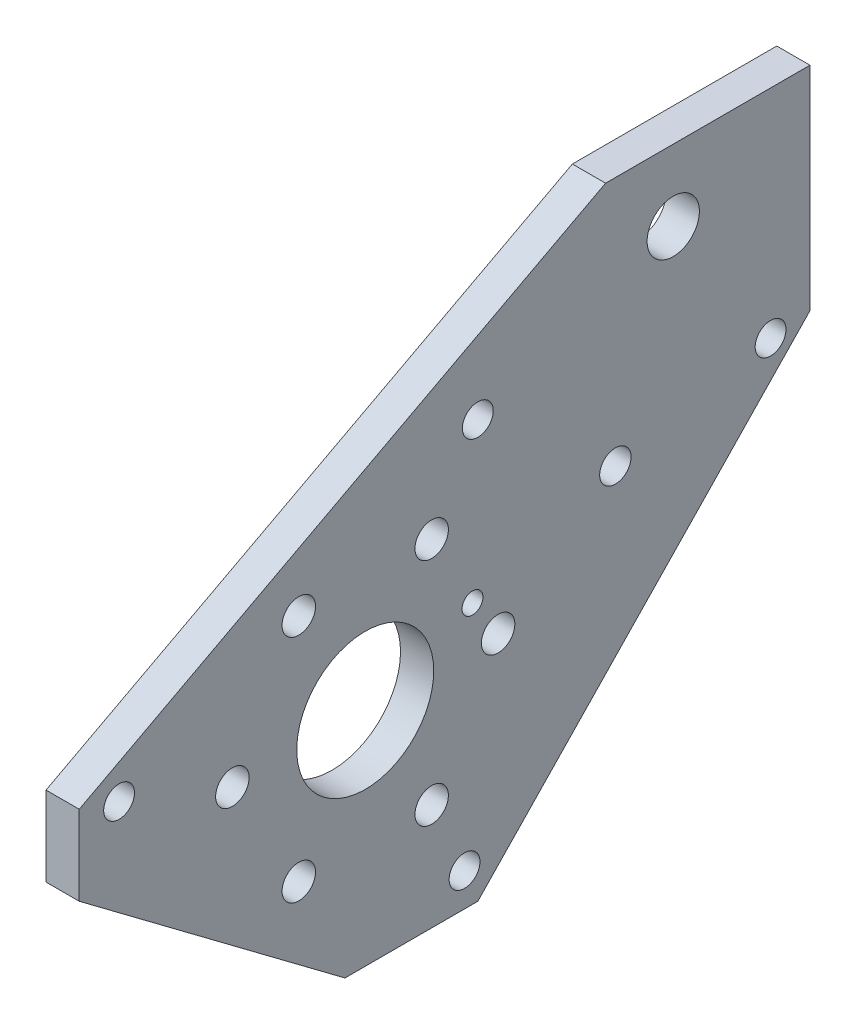
ISO-10303-21;
HEADER;
FILE_DESCRIPTION(('STEP AP214'),'2;1');
FILE_NAME('part.step','',(''),(''),'','','');
FILE_SCHEMA(('AUTOMOTIVE_DESIGN { 1 0 10303 214 1 1 1 1 }'));
ENDSEC;
DATA;
#1=APPLICATION_CONTEXT('core data for automotive mechanical design processes');
#2=APPLICATION_PROTOCOL_DEFINITION('international standard','automotive_design',2000,#1);
#3=PRODUCT_CONTEXT('',#1,'mechanical');
#4=PRODUCT('Part','Part','',(#3));
#5=PRODUCT_RELATED_PRODUCT_CATEGORY('part','',(#4));
#6=PRODUCT_DEFINITION_FORMATION('','',#4);
#7=PRODUCT_DEFINITION_CONTEXT('part definition',#1,'design');
#8=PRODUCT_DEFINITION('design','',#6,#7);
#9=PRODUCT_DEFINITION_SHAPE('','',#8);
#10=(LENGTH_UNIT() NAMED_UNIT(*) SI_UNIT(.MILLI.,.METRE.));
#11=(NAMED_UNIT(*) PLANE_ANGLE_UNIT() SI_UNIT($,.RADIAN.));
#12=(NAMED_UNIT(*) SI_UNIT($,.STERADIAN.) SOLID_ANGLE_UNIT());
#13=UNCERTAINTY_MEASURE_WITH_UNIT(LENGTH_MEASURE(1.E-05),#10,'distance_accuracy_value','');
#14=(GEOMETRIC_REPRESENTATION_CONTEXT(3) GLOBAL_UNCERTAINTY_ASSIGNED_CONTEXT((#13)) GLOBAL_UNIT_ASSIGNED_CONTEXT((#10,
#11,#12)) REPRESENTATION_CONTEXT('',''));
#15=CARTESIAN_POINT('',(0.,0.,0.));
#16=DIRECTION('',(0.,0.,1.));
#17=DIRECTION('',(1.,0.,0.));
#18=AXIS2_PLACEMENT_3D('',#15,#16,#17);
#19=CARTESIAN_POINT('',(3.175,0.,0.));
#20=DIRECTION('',(0.,0.,-1.));
#21=DIRECTION('',(-1.,0.,0.));
#22=AXIS2_PLACEMENT_3D('',#19,#20,#21);
#23=PLANE('',#22);
#24=DIRECTION('',(0.,-1.,0.));
#25=VECTOR('',#24,1.);
#26=CARTESIAN_POINT('',(0.,0.,0.));
#27=LINE('',#26,#25);
#28=CARTESIAN_POINT('',(0.,26.67,0.));
#29=VERTEX_POINT('',#28);
#30=CARTESIAN_POINT('',(0.,19.05,0.));
#31=VERTEX_POINT('',#30);
#32=EDGE_CURVE('E109',#29,#31,#27,.T.);
#33=ORIENTED_EDGE('',*,*,#32,.T.);
#34=DIRECTION('',(1.,0.,0.));
#35=VECTOR('',#34,1.);
#36=CARTESIAN_POINT('',(0.,19.05,0.));
#37=LINE('',#36,#35);
#38=CARTESIAN_POINT('',(3.175,19.05,0.));
#39=VERTEX_POINT('',#38);
#40=EDGE_CURVE('E47',#31,#39,#37,.T.);
#41=ORIENTED_EDGE('',*,*,#40,.T.);
#42=DIRECTION('',(0.,-1.,0.));
#43=VECTOR('',#42,1.);
#44=CARTESIAN_POINT('',(3.175,0.,0.));
#45=LINE('',#44,#43);
#46=CARTESIAN_POINT('',(3.175,26.67,0.));
#47=VERTEX_POINT('',#46);
#48=EDGE_CURVE('E118',#47,#39,#45,.T.);
#49=ORIENTED_EDGE('',*,*,#48,.F.);
#50=DIRECTION('',(1.,0.,0.));
#51=VECTOR('',#50,1.);
#52=CARTESIAN_POINT('',(0.,26.67,0.));
#53=LINE('',#52,#51);
#54=EDGE_CURVE('E144',#29,#47,#53,.T.);
#55=ORIENTED_EDGE('',*,*,#54,.F.);
#56=EDGE_LOOP('',(#33,#41,#49,#55));
#57=FACE_BOUND('',#56,.T.);
#58=ADVANCED_FACE('F32',(#57),#23,.F.);
#59=CARTESIAN_POINT('',(3.175,0.,0.));
#60=DIRECTION('',(0.,1.,0.));
#61=DIRECTION('',(0.,0.,1.));
#62=AXIS2_PLACEMENT_3D('',#59,#60,#61);
#63=PLANE('',#62);
#64=DIRECTION('',(0.,0.,-1.));
#65=VECTOR('',#64,1.);
#66=CARTESIAN_POINT('',(3.175,0.,0.));
#67=LINE('',#66,#65);
#68=CARTESIAN_POINT('',(3.175,0.,-25.4));
#69=VERTEX_POINT('',#68);
#70=CARTESIAN_POINT('',(3.175,0.,-38.1));
#71=VERTEX_POINT('',#70);
#72=EDGE_CURVE('E101',#69,#71,#67,.T.);
#73=ORIENTED_EDGE('',*,*,#72,.F.);
#74=DIRECTION('',(1.,0.,0.));
#75=VECTOR('',#74,1.);
#76=CARTESIAN_POINT('',(0.,0.,-25.4));
#77=LINE('',#76,#75);
#78=CARTESIAN_POINT('',(0.,0.,-25.4));
#79=VERTEX_POINT('',#78);
#80=EDGE_CURVE('E92',#79,#69,#77,.T.);
#81=ORIENTED_EDGE('',*,*,#80,.F.);
#82=DIRECTION('',(0.,0.,-1.));
#83=VECTOR('',#82,1.);
#84=CARTESIAN_POINT('',(0.,0.,0.));
#85=LINE('',#84,#83);
#86=CARTESIAN_POINT('',(0.,0.,-38.1));
#87=VERTEX_POINT('',#86);
#88=EDGE_CURVE('E55',#79,#87,#85,.T.);
#89=ORIENTED_EDGE('',*,*,#88,.T.);
#90=DIRECTION('',(1.,0.,0.));
#91=VECTOR('',#90,1.);
#92=CARTESIAN_POINT('',(0.,0.,-38.1));
#93=LINE('',#92,#91);
#94=EDGE_CURVE('E232',#87,#71,#93,.T.);
#95=ORIENTED_EDGE('',*,*,#94,.T.);
#96=EDGE_LOOP('',(#73,#81,#89,#95));
#97=FACE_BOUND('',#96,.T.);
#98=ADVANCED_FACE('F100',(#97),#63,.F.);
#99=CARTESIAN_POINT('',(3.175,0.,-69.85));
#100=DIRECTION('',(0.,0.,1.));
#101=DIRECTION('',(1.,0.,0.));
#102=AXIS2_PLACEMENT_3D('',#99,#100,#101);
#103=PLANE('',#102);
#104=DIRECTION('',(0.,1.,0.));
#105=VECTOR('',#104,1.);
#106=CARTESIAN_POINT('',(3.175,0.,-69.85));
#107=LINE('',#106,#105);
#108=CARTESIAN_POINT('',(3.175,33.02,-69.85));
#109=VERTEX_POINT('',#108);
#110=CARTESIAN_POINT('',(3.175,53.34,-69.85));
#111=VERTEX_POINT('',#110);
#112=EDGE_CURVE('E127',#109,#111,#107,.T.);
#113=ORIENTED_EDGE('',*,*,#112,.F.);
#114=DIRECTION('',(1.,0.,0.));
#115=VECTOR('',#114,1.);
#116=CARTESIAN_POINT('',(0.,33.02,-69.85));
#117=LINE('',#116,#115);
#118=CARTESIAN_POINT('',(0.,33.02,-69.85));
#119=VERTEX_POINT('',#118);
#120=EDGE_CURVE('E234',#119,#109,#117,.T.);
#121=ORIENTED_EDGE('',*,*,#120,.F.);
#122=DIRECTION('',(0.,1.,0.));
#123=VECTOR('',#122,1.);
#124=CARTESIAN_POINT('',(0.,0.,-69.85));
#125=LINE('',#124,#123);
#126=CARTESIAN_POINT('',(0.,53.34,-69.85));
#127=VERTEX_POINT('',#126);
#128=EDGE_CURVE('E108',#119,#127,#125,.T.);
#129=ORIENTED_EDGE('',*,*,#128,.T.);
#130=DIRECTION('',(-1.,0.,0.));
#131=VECTOR('',#130,1.);
#132=CARTESIAN_POINT('',(3.175,53.34,-69.85));
#133=LINE('',#132,#131);
#134=EDGE_CURVE('E11',#111,#127,#133,.T.);
#135=ORIENTED_EDGE('',*,*,#134,.F.);
#136=EDGE_LOOP('',(#113,#121,#129,#135));
#137=FACE_BOUND('',#136,.T.);
#138=ADVANCED_FACE('F230',(#137),#103,.F.);
#139=CARTESIAN_POINT('',(3.175,53.34,0.));
#140=DIRECTION('',(0.,-1.,0.));
#141=DIRECTION('',(0.,0.,-1.));
#142=AXIS2_PLACEMENT_3D('',#139,#140,#141);
#143=PLANE('',#142);
#144=DIRECTION('',(0.,0.,1.));
#145=VECTOR('',#144,1.);
#146=CARTESIAN_POINT('',(0.,53.34,0.));
#147=LINE('',#146,#145);
#148=CARTESIAN_POINT('',(0.,53.34,-50.3135330931421));
#149=VERTEX_POINT('',#148);
#150=EDGE_CURVE('E111',#127,#149,#147,.T.);
#151=ORIENTED_EDGE('',*,*,#150,.T.);
#152=DIRECTION('',(1.,0.,0.));
#153=VECTOR('',#152,1.);
#154=CARTESIAN_POINT('',(0.,53.34,-50.3135330931421));
#155=LINE('',#154,#153);
#156=CARTESIAN_POINT('',(3.175,53.34,-50.3135330931421));
#157=VERTEX_POINT('',#156);
#158=EDGE_CURVE('E140',#149,#157,#155,.T.);
#159=ORIENTED_EDGE('',*,*,#158,.T.);
#160=DIRECTION('',(0.,0.,1.));
#161=VECTOR('',#160,1.);
#162=CARTESIAN_POINT('',(3.175,53.34,0.));
#163=LINE('',#162,#161);
#164=EDGE_CURVE('E40',#111,#157,#163,.T.);
#165=ORIENTED_EDGE('',*,*,#164,.F.);
#166=ORIENTED_EDGE('',*,*,#134,.T.);
#167=EDGE_LOOP('',(#151,#159,#165,#166));
#168=FACE_BOUND('',#167,.T.);
#169=ADVANCED_FACE('F139',(#168),#143,.F.);
#170=CARTESIAN_POINT('',(3.175,0.,0.));
#171=DIRECTION('',(-1.,0.,0.));
#172=DIRECTION('',(0.,0.,1.));
#173=AXIS2_PLACEMENT_3D('',#170,#171,#172);
#174=PLANE('',#173);
#175=CARTESIAN_POINT('',(3.175,25.4,-3.81));
#176=DIRECTION('',(1.,0.,0.));
#177=DIRECTION('',(0.,0.,-1.));
#178=AXIS2_PLACEMENT_3D('',#175,#176,#177);
#179=CIRCLE('',#178,1.4732);
#180=CARTESIAN_POINT('',(3.175,25.4,-5.2832));
#181=VERTEX_POINT('',#180);
#182=EDGE_CURVE('E263',#181,#181,#179,.T.);
#183=ORIENTED_EDGE('',*,*,#182,.F.);
#184=EDGE_LOOP('',(#183));
#185=FACE_BOUND('',#184,.T.);
#186=CARTESIAN_POINT('',(3.175,3.175,-36.83));
#187=DIRECTION('',(1.,0.,0.));
#188=DIRECTION('',(0.,0.,-1.));
#189=AXIS2_PLACEMENT_3D('',#186,#187,#188);
#190=CIRCLE('',#189,1.4732);
#191=CARTESIAN_POINT('',(3.175,3.175,-38.3032));
#192=VERTEX_POINT('',#191);
#193=EDGE_CURVE('E258',#192,#192,#190,.T.);
#194=ORIENTED_EDGE('',*,*,#193,.F.);
#195=EDGE_LOOP('',(#194));
#196=FACE_BOUND('',#195,.T.);
#197=CARTESIAN_POINT('',(3.175,32.62292688,-66.08666234));
#198=DIRECTION('',(1.,0.,0.));
#199=DIRECTION('',(0.,0.,-1.));
#200=AXIS2_PLACEMENT_3D('',#197,#198,#199);
#201=CIRCLE('',#200,1.4732);
#202=CARTESIAN_POINT('',(3.175,32.62292688,-67.55986234));
#203=VERTEX_POINT('',#202);
#204=EDGE_CURVE('E252',#203,#203,#201,.T.);
#205=ORIENTED_EDGE('',*,*,#204,.F.);
#206=EDGE_LOOP('',(#205));
#207=FACE_BOUND('',#206,.T.);
#208=CARTESIAN_POINT('',(3.175,39.878,-38.1));
#209=DIRECTION('',(1.,0.,0.));
#210=DIRECTION('',(0.,0.,-1.));
#211=AXIS2_PLACEMENT_3D('',#208,#209,#210);
#212=CIRCLE('',#211,1.4732);
#213=CARTESIAN_POINT('',(3.175,39.878,-39.5732));
#214=VERTEX_POINT('',#213);
#215=EDGE_CURVE('E246',#214,#214,#212,.T.);
#216=ORIENTED_EDGE('',*,*,#215,.F.);
#217=EDGE_LOOP('',(#216));
#218=FACE_BOUND('',#217,.T.);
#219=CARTESIAN_POINT('',(3.175,46.53348834,-56.78027506));
#220=DIRECTION('',(1.,0.,0.));
#221=DIRECTION('',(0.,0.,-1.));
#222=AXIS2_PLACEMENT_3D('',#219,#220,#221);
#223=CIRCLE('',#222,2.5);
#224=CARTESIAN_POINT('',(3.175,46.53348834,-59.28027506));
#225=VERTEX_POINT('',#224);
#226=EDGE_CURVE('E143',#225,#225,#223,.T.);
#227=ORIENTED_EDGE('',*,*,#226,.F.);
#228=EDGE_LOOP('',(#227));
#229=FACE_BOUND('',#228,.T.);
#230=CARTESIAN_POINT('',(3.175,29.46260554,-51.24750482));
#231=DIRECTION('',(1.,0.,0.));
#232=DIRECTION('',(0.,0.,-1.));
#233=AXIS2_PLACEMENT_3D('',#230,#231,#232);
#234=CIRCLE('',#233,1.5);
#235=CARTESIAN_POINT('',(3.175,29.46260554,-52.74750482));
#236=VERTEX_POINT('',#235);
#237=EDGE_CURVE('E153',#236,#236,#234,.T.);
#238=ORIENTED_EDGE('',*,*,#237,.F.);
#239=EDGE_LOOP('',(#238));
#240=FACE_BOUND('',#239,.T.);
#241=CARTESIAN_POINT('',(3.175,24.95127344,-37.59058776));
#242=DIRECTION('',(1.,0.,0.));
#243=DIRECTION('',(0.,0.,-1.));
#244=AXIS2_PLACEMENT_3D('',#241,#242,#243);
#245=CIRCLE('',#244,0.999999999999997);
#246=CARTESIAN_POINT('',(3.175,24.95127344,-38.59058776));
#247=VERTEX_POINT('',#246);
#248=EDGE_CURVE('E159',#247,#247,#245,.T.);
#249=ORIENTED_EDGE('',*,*,#248,.F.);
#250=EDGE_LOOP('',(#249));
#251=FACE_BOUND('',#250,.T.);
#252=CARTESIAN_POINT('',(3.175,21.18693756,-40.03778886));
#253=DIRECTION('',(-1.,0.,0.));
#254=DIRECTION('',(0.,0.,1.));
#255=AXIS2_PLACEMENT_3D('',#252,#253,#254);
#256=CIRCLE('',#255,1.6);
#257=CARTESIAN_POINT('',(3.175,21.18693756,-38.43778886));
#258=VERTEX_POINT('',#257);
#259=EDGE_CURVE('E168',#258,#258,#256,.T.);
#260=ORIENTED_EDGE('',*,*,#259,.T.);
#261=EDGE_LOOP('',(#260));
#262=FACE_BOUND('',#261,.T.);
#263=CARTESIAN_POINT('',(3.175,32.1854601880624,-33.68778886));
#264=DIRECTION('',(-1.,0.,0.));
#265=DIRECTION('',(0.,0.,1.));
#266=AXIS2_PLACEMENT_3D('',#263,#264,#265);
#267=CIRCLE('',#266,1.59999999999999);
#268=CARTESIAN_POINT('',(3.175,32.1854601880624,-32.08778886));
#269=VERTEX_POINT('',#268);
#270=EDGE_CURVE('E174',#269,#269,#267,.T.);
#271=ORIENTED_EDGE('',*,*,#270,.T.);
#272=EDGE_LOOP('',(#271));
#273=FACE_BOUND('',#272,.T.);
#274=CARTESIAN_POINT('',(3.175,32.1854601880624,-20.98778886));
#275=DIRECTION('',(-1.,0.,0.));
#276=DIRECTION('',(0.,0.,1.));
#277=AXIS2_PLACEMENT_3D('',#274,#275,#276);
#278=CIRCLE('',#277,1.6);
#279=CARTESIAN_POINT('',(3.175,32.1854601880624,-19.38778886));
#280=VERTEX_POINT('',#279);
#281=EDGE_CURVE('E180',#280,#280,#278,.T.);
#282=ORIENTED_EDGE('',*,*,#281,.T.);
#283=EDGE_LOOP('',(#282));
#284=FACE_BOUND('',#283,.T.);
#285=CARTESIAN_POINT('',(3.175,21.1869375599999,-14.63778886));
#286=DIRECTION('',(-1.,0.,0.));
#287=DIRECTION('',(0.,0.,1.));
#288=AXIS2_PLACEMENT_3D('',#285,#286,#287);
#289=CIRCLE('',#288,1.6);
#290=CARTESIAN_POINT('',(3.175,21.1869375599999,-13.03778886));
#291=VERTEX_POINT('',#290);
#292=EDGE_CURVE('E186',#291,#291,#289,.T.);
#293=ORIENTED_EDGE('',*,*,#292,.T.);
#294=EDGE_LOOP('',(#293));
#295=FACE_BOUND('',#294,.T.);
#296=CARTESIAN_POINT('',(3.175,10.1884149319376,-20.9877888600001));
#297=DIRECTION('',(-1.,0.,0.));
#298=DIRECTION('',(0.,0.,1.));
#299=AXIS2_PLACEMENT_3D('',#296,#297,#298);
#300=CIRCLE('',#299,1.6);
#301=CARTESIAN_POINT('',(3.175,10.1884149319376,-19.3877888600001));
#302=VERTEX_POINT('',#301);
#303=EDGE_CURVE('E192',#302,#302,#300,.T.);
#304=ORIENTED_EDGE('',*,*,#303,.T.);
#305=EDGE_LOOP('',(#304));
#306=FACE_BOUND('',#305,.T.);
#307=CARTESIAN_POINT('',(3.175,10.1884149319377,-33.6877888600001));
#308=DIRECTION('',(-1.,0.,0.));
#309=DIRECTION('',(0.,0.,1.));
#310=AXIS2_PLACEMENT_3D('',#307,#308,#309);
#311=CIRCLE('',#310,1.6);
#312=CARTESIAN_POINT('',(3.175,10.1884149319377,-32.0877888600001));
#313=VERTEX_POINT('',#312);
#314=EDGE_CURVE('E198',#313,#313,#311,.T.);
#315=ORIENTED_EDGE('',*,*,#314,.T.);
#316=EDGE_LOOP('',(#315));
#317=FACE_BOUND('',#316,.T.);
#318=CARTESIAN_POINT('',(3.175,21.18693756,-27.33778886));
#319=DIRECTION('',(1.,0.,0.));
#320=DIRECTION('',(0.,0.,-1.));
#321=AXIS2_PLACEMENT_3D('',#318,#319,#320);
#322=CIRCLE('',#321,6.54812);
#323=CARTESIAN_POINT('',(3.175,21.18693756,-33.88590886));
#324=VERTEX_POINT('',#323);
#325=EDGE_CURVE('E200',#324,#324,#322,.T.);
#326=ORIENTED_EDGE('',*,*,#325,.F.);
#327=EDGE_LOOP('',(#326));
#328=FACE_BOUND('',#327,.T.);
#329=ORIENTED_EDGE('',*,*,#48,.T.);
#330=DIRECTION('',(0.,0.6,0.8));
#331=VECTOR('',#330,1.);
#332=CARTESIAN_POINT('',(3.175,0.,-25.4));
#333=LINE('',#332,#331);
#334=EDGE_CURVE('E97',#69,#39,#333,.T.);
#335=ORIENTED_EDGE('',*,*,#334,.F.);
#336=ORIENTED_EDGE('',*,*,#72,.T.);
#337=DIRECTION('',(0.,-0.720833064901856,0.693108716251784));
#338=VECTOR('',#337,1.);
#339=CARTESIAN_POINT('',(3.175,0.,-38.1));
#340=LINE('',#339,#338);
#341=EDGE_CURVE('E237',#109,#71,#340,.T.);
#342=ORIENTED_EDGE('',*,*,#341,.F.);
#343=ORIENTED_EDGE('',*,*,#112,.T.);
#344=ORIENTED_EDGE('',*,*,#164,.T.);
#345=DIRECTION('',(0.,0.468346109582566,-0.883545087496318));
#346=VECTOR('',#345,1.);
#347=CARTESIAN_POINT('',(3.175,53.34,-50.3135330931421));
#348=LINE('',#347,#346);
#349=EDGE_CURVE('E135',#47,#157,#348,.T.);
#350=ORIENTED_EDGE('',*,*,#349,.F.);
#351=EDGE_LOOP('',(#329,#335,#336,#342,#343,#344,#350));
#352=FACE_BOUND('',#351,.T.);
#353=ADVANCED_FACE('F134',(#185,#196,#207,#218,#229,#240,#251,#262,#273,#284,#295,#306,#317,
#328,#352),#174,.F.);
#354=CARTESIAN_POINT('',(0.,0.,0.));
#355=DIRECTION('',(-1.,0.,0.));
#356=DIRECTION('',(0.,0.,1.));
#357=AXIS2_PLACEMENT_3D('',#354,#355,#356);
#358=PLANE('',#357);
#359=CARTESIAN_POINT('',(0.,25.4,-3.81));
#360=DIRECTION('',(1.,0.,0.));
#361=DIRECTION('',(0.,0.,-1.));
#362=AXIS2_PLACEMENT_3D('',#359,#360,#361);
#363=CIRCLE('',#362,1.4732);
#364=CARTESIAN_POINT('',(0.,25.4,-5.2832));
#365=VERTEX_POINT('',#364);
#366=EDGE_CURVE('E261',#365,#365,#363,.T.);
#367=ORIENTED_EDGE('',*,*,#366,.T.);
#368=EDGE_LOOP('',(#367));
#369=FACE_BOUND('',#368,.T.);
#370=CARTESIAN_POINT('',(0.,3.175,-36.83));
#371=DIRECTION('',(1.,0.,0.));
#372=DIRECTION('',(0.,0.,-1.));
#373=AXIS2_PLACEMENT_3D('',#370,#371,#372);
#374=CIRCLE('',#373,1.4732);
#375=CARTESIAN_POINT('',(0.,3.175,-38.3032));
#376=VERTEX_POINT('',#375);
#377=EDGE_CURVE('E255',#376,#376,#374,.T.);
#378=ORIENTED_EDGE('',*,*,#377,.T.);
#379=EDGE_LOOP('',(#378));
#380=FACE_BOUND('',#379,.T.);
#381=CARTESIAN_POINT('',(0.,32.62292688,-66.08666234));
#382=DIRECTION('',(1.,0.,0.));
#383=DIRECTION('',(0.,0.,-1.));
#384=AXIS2_PLACEMENT_3D('',#381,#382,#383);
#385=CIRCLE('',#384,1.4732);
#386=CARTESIAN_POINT('',(0.,32.62292688,-67.55986234));
#387=VERTEX_POINT('',#386);
#388=EDGE_CURVE('E249',#387,#387,#385,.T.);
#389=ORIENTED_EDGE('',*,*,#388,.T.);
#390=EDGE_LOOP('',(#389));
#391=FACE_BOUND('',#390,.T.);
#392=CARTESIAN_POINT('',(0.,39.878,-38.1));
#393=DIRECTION('',(1.,0.,0.));
#394=DIRECTION('',(0.,0.,-1.));
#395=AXIS2_PLACEMENT_3D('',#392,#393,#394);
#396=CIRCLE('',#395,1.4732);
#397=CARTESIAN_POINT('',(0.,39.878,-39.5732));
#398=VERTEX_POINT('',#397);
#399=EDGE_CURVE('E242',#398,#398,#396,.T.);
#400=ORIENTED_EDGE('',*,*,#399,.T.);
#401=EDGE_LOOP('',(#400));
#402=FACE_BOUND('',#401,.T.);
#403=DIRECTION('',(0.,0.6,0.8));
#404=VECTOR('',#403,1.);
#405=CARTESIAN_POINT('',(0.,0.,-25.4));
#406=LINE('',#405,#404);
#407=EDGE_CURVE('E90',#79,#31,#406,.T.);
#408=ORIENTED_EDGE('',*,*,#407,.T.);
#409=ORIENTED_EDGE('',*,*,#32,.F.);
#410=DIRECTION('',(0.,0.468346109582566,-0.883545087496318));
#411=VECTOR('',#410,1.);
#412=CARTESIAN_POINT('',(0.,53.34,-50.3135330931421));
#413=LINE('',#412,#411);
#414=EDGE_CURVE('E148',#29,#149,#413,.T.);
#415=ORIENTED_EDGE('',*,*,#414,.T.);
#416=ORIENTED_EDGE('',*,*,#150,.F.);
#417=ORIENTED_EDGE('',*,*,#128,.F.);
#418=DIRECTION('',(0.,-0.720833064901856,0.693108716251784));
#419=VECTOR('',#418,1.);
#420=CARTESIAN_POINT('',(0.,0.,-38.1));
#421=LINE('',#420,#419);
#422=EDGE_CURVE('E107',#119,#87,#421,.T.);
#423=ORIENTED_EDGE('',*,*,#422,.T.);
#424=ORIENTED_EDGE('',*,*,#88,.F.);
#425=EDGE_LOOP('',(#408,#409,#415,#416,#417,#423,#424));
#426=FACE_BOUND('',#425,.T.);
#427=CARTESIAN_POINT('',(0.,46.53348834,-56.78027506));
#428=DIRECTION('',(-1.,0.,0.));
#429=DIRECTION('',(0.,0.,1.));
#430=AXIS2_PLACEMENT_3D('',#427,#428,#429);
#431=CIRCLE('',#430,2.5);
#432=CARTESIAN_POINT('',(0.,46.53348834,-54.28027506));
#433=VERTEX_POINT('',#432);
#434=EDGE_CURVE('E35',#433,#433,#431,.T.);
#435=ORIENTED_EDGE('',*,*,#434,.F.);
#436=EDGE_LOOP('',(#435));
#437=FACE_BOUND('',#436,.T.);
#438=CARTESIAN_POINT('',(0.,29.46260554,-51.24750482));
#439=DIRECTION('',(-1.,0.,0.));
#440=DIRECTION('',(0.,0.,1.));
#441=AXIS2_PLACEMENT_3D('',#438,#439,#440);
#442=CIRCLE('',#441,1.5);
#443=CARTESIAN_POINT('',(0.,29.46260554,-49.74750482));
#444=VERTEX_POINT('',#443);
#445=EDGE_CURVE('E156',#444,#444,#442,.T.);
#446=ORIENTED_EDGE('',*,*,#445,.F.);
#447=EDGE_LOOP('',(#446));
#448=FACE_BOUND('',#447,.T.);
#449=CARTESIAN_POINT('',(0.,24.95127344,-37.59058776));
#450=DIRECTION('',(-1.,0.,0.));
#451=DIRECTION('',(0.,0.,1.));
#452=AXIS2_PLACEMENT_3D('',#449,#450,#451);
#453=CIRCLE('',#452,0.999999999999996);
#454=CARTESIAN_POINT('',(0.,24.95127344,-36.59058776));
#455=VERTEX_POINT('',#454);
#456=EDGE_CURVE('E162',#455,#455,#453,.T.);
#457=ORIENTED_EDGE('',*,*,#456,.F.);
#458=EDGE_LOOP('',(#457));
#459=FACE_BOUND('',#458,.T.);
#460=CARTESIAN_POINT('',(0.,21.18693756,-40.03778886));
#461=DIRECTION('',(-1.,0.,0.));
#462=DIRECTION('',(0.,0.,1.));
#463=AXIS2_PLACEMENT_3D('',#460,#461,#462);
#464=CIRCLE('',#463,1.6);
#465=CARTESIAN_POINT('',(0.,21.18693756,-38.43778886));
#466=VERTEX_POINT('',#465);
#467=EDGE_CURVE('E165',#466,#466,#464,.T.);
#468=ORIENTED_EDGE('',*,*,#467,.F.);
#469=EDGE_LOOP('',(#468));
#470=FACE_BOUND('',#469,.T.);
#471=CARTESIAN_POINT('',(0.,32.1854601880624,-33.68778886));
#472=DIRECTION('',(-1.,0.,0.));
#473=DIRECTION('',(0.,0.,1.));
#474=AXIS2_PLACEMENT_3D('',#471,#472,#473);
#475=CIRCLE('',#474,1.6);
#476=CARTESIAN_POINT('',(0.,32.1854601880624,-32.08778886));
#477=VERTEX_POINT('',#476);
#478=EDGE_CURVE('E171',#477,#477,#475,.T.);
#479=ORIENTED_EDGE('',*,*,#478,.F.);
#480=EDGE_LOOP('',(#479));
#481=FACE_BOUND('',#480,.T.);
#482=CARTESIAN_POINT('',(0.,32.1854601880624,-20.98778886));
#483=DIRECTION('',(-1.,0.,0.));
#484=DIRECTION('',(0.,0.,1.));
#485=AXIS2_PLACEMENT_3D('',#482,#483,#484);
#486=CIRCLE('',#485,1.6);
#487=CARTESIAN_POINT('',(0.,32.1854601880624,-19.38778886));
#488=VERTEX_POINT('',#487);
#489=EDGE_CURVE('E177',#488,#488,#486,.T.);
#490=ORIENTED_EDGE('',*,*,#489,.F.);
#491=EDGE_LOOP('',(#490));
#492=FACE_BOUND('',#491,.T.);
#493=CARTESIAN_POINT('',(0.,21.1869375599999,-14.63778886));
#494=DIRECTION('',(-1.,0.,0.));
#495=DIRECTION('',(0.,0.,1.));
#496=AXIS2_PLACEMENT_3D('',#493,#494,#495);
#497=CIRCLE('',#496,1.6);
#498=CARTESIAN_POINT('',(0.,21.1869375599999,-13.03778886));
#499=VERTEX_POINT('',#498);
#500=EDGE_CURVE('E183',#499,#499,#497,.T.);
#501=ORIENTED_EDGE('',*,*,#500,.F.);
#502=EDGE_LOOP('',(#501));
#503=FACE_BOUND('',#502,.T.);
#504=CARTESIAN_POINT('',(0.,10.1884149319376,-20.9877888600001));
#505=DIRECTION('',(-1.,0.,0.));
#506=DIRECTION('',(0.,0.,1.));
#507=AXIS2_PLACEMENT_3D('',#504,#505,#506);
#508=CIRCLE('',#507,1.6);
#509=CARTESIAN_POINT('',(0.,10.1884149319376,-19.3877888600001));
#510=VERTEX_POINT('',#509);
#511=EDGE_CURVE('E189',#510,#510,#508,.T.);
#512=ORIENTED_EDGE('',*,*,#511,.F.);
#513=EDGE_LOOP('',(#512));
#514=FACE_BOUND('',#513,.T.);
#515=CARTESIAN_POINT('',(0.,10.1884149319377,-33.6877888600001));
#516=DIRECTION('',(-1.,0.,0.));
#517=DIRECTION('',(0.,0.,1.));
#518=AXIS2_PLACEMENT_3D('',#515,#516,#517);
#519=CIRCLE('',#518,1.6);
#520=CARTESIAN_POINT('',(0.,10.1884149319377,-32.0877888600001));
#521=VERTEX_POINT('',#520);
#522=EDGE_CURVE('E195',#521,#521,#519,.T.);
#523=ORIENTED_EDGE('',*,*,#522,.F.);
#524=EDGE_LOOP('',(#523));
#525=FACE_BOUND('',#524,.T.);
#526=CARTESIAN_POINT('',(0.,21.18693756,-27.33778886));
#527=DIRECTION('',(-1.,0.,0.));
#528=DIRECTION('',(0.,0.,1.));
#529=AXIS2_PLACEMENT_3D('',#526,#527,#528);
#530=CIRCLE('',#529,6.54812);
#531=CARTESIAN_POINT('',(0.,21.18693756,-20.78966886));
#532=VERTEX_POINT('',#531);
#533=EDGE_CURVE('E113',#532,#532,#530,.T.);
#534=ORIENTED_EDGE('',*,*,#533,.F.);
#535=EDGE_LOOP('',(#534));
#536=FACE_BOUND('',#535,.T.);
#537=ADVANCED_FACE('F104',(#369,#380,#391,#402,#426,#437,#448,#459,#470,#481,#492,#503,#514,
#525,#536),#358,.T.);
#538=CARTESIAN_POINT('',(3.175,21.18693756,-27.33778886));
#539=DIRECTION('',(1.,0.,0.));
#540=DIRECTION('',(0.,0.,-1.));
#541=AXIS2_PLACEMENT_3D('',#538,#539,#540);
#542=CYLINDRICAL_SURFACE('',#541,6.54812);
#543=ORIENTED_EDGE('',*,*,#533,.T.);
#544=EDGE_LOOP('',(#543));
#545=FACE_BOUND('',#544,.T.);
#546=ORIENTED_EDGE('',*,*,#325,.T.);
#547=EDGE_LOOP('',(#546));
#548=FACE_BOUND('',#547,.T.);
#549=ADVANCED_FACE('F207',(#545,#548),#542,.F.);
#550=CARTESIAN_POINT('',(0.,10.1884149319377,-33.6877888600001));
#551=DIRECTION('',(-1.,0.,0.));
#552=DIRECTION('',(0.,0.,1.));
#553=AXIS2_PLACEMENT_3D('',#550,#551,#552);
#554=CYLINDRICAL_SURFACE('',#553,1.6);
#555=ORIENTED_EDGE('',*,*,#522,.T.);
#556=EDGE_LOOP('',(#555));
#557=FACE_BOUND('',#556,.T.);
#558=ORIENTED_EDGE('',*,*,#314,.F.);
#559=EDGE_LOOP('',(#558));
#560=FACE_BOUND('',#559,.T.);
#561=ADVANCED_FACE('F217',(#557,#560),#554,.F.);
#562=CARTESIAN_POINT('',(0.,10.1884149319376,-20.9877888600001));
#563=DIRECTION('',(-1.,0.,0.));
#564=DIRECTION('',(0.,0.,1.));
#565=AXIS2_PLACEMENT_3D('',#562,#563,#564);
#566=CYLINDRICAL_SURFACE('',#565,1.6);
#567=ORIENTED_EDGE('',*,*,#511,.T.);
#568=EDGE_LOOP('',(#567));
#569=FACE_BOUND('',#568,.T.);
#570=ORIENTED_EDGE('',*,*,#303,.F.);
#571=EDGE_LOOP('',(#570));
#572=FACE_BOUND('',#571,.T.);
#573=ADVANCED_FACE('F295',(#569,#572),#566,.F.);
#574=CARTESIAN_POINT('',(0.,21.1869375599999,-14.63778886));
#575=DIRECTION('',(-1.,0.,0.));
#576=DIRECTION('',(0.,0.,1.));
#577=AXIS2_PLACEMENT_3D('',#574,#575,#576);
#578=CYLINDRICAL_SURFACE('',#577,1.6);
#579=ORIENTED_EDGE('',*,*,#500,.T.);
#580=EDGE_LOOP('',(#579));
#581=FACE_BOUND('',#580,.T.);
#582=ORIENTED_EDGE('',*,*,#292,.F.);
#583=EDGE_LOOP('',(#582));
#584=FACE_BOUND('',#583,.T.);
#585=ADVANCED_FACE('F301',(#581,#584),#578,.F.);
#586=CARTESIAN_POINT('',(0.,32.1854601880624,-20.98778886));
#587=DIRECTION('',(-1.,0.,0.));
#588=DIRECTION('',(0.,0.,1.));
#589=AXIS2_PLACEMENT_3D('',#586,#587,#588);
#590=CYLINDRICAL_SURFACE('',#589,1.6);
#591=ORIENTED_EDGE('',*,*,#489,.T.);
#592=EDGE_LOOP('',(#591));
#593=FACE_BOUND('',#592,.T.);
#594=ORIENTED_EDGE('',*,*,#281,.F.);
#595=EDGE_LOOP('',(#594));
#596=FACE_BOUND('',#595,.T.);
#597=ADVANCED_FACE('F307',(#593,#596),#590,.F.);
#598=CARTESIAN_POINT('',(0.,32.1854601880624,-33.68778886));
#599=DIRECTION('',(-1.,0.,0.));
#600=DIRECTION('',(0.,0.,1.));
#601=AXIS2_PLACEMENT_3D('',#598,#599,#600);
#602=CYLINDRICAL_SURFACE('',#601,1.59999999999999);
#603=ORIENTED_EDGE('',*,*,#478,.T.);
#604=EDGE_LOOP('',(#603));
#605=FACE_BOUND('',#604,.T.);
#606=ORIENTED_EDGE('',*,*,#270,.F.);
#607=EDGE_LOOP('',(#606));
#608=FACE_BOUND('',#607,.T.);
#609=ADVANCED_FACE('F311',(#605,#608),#602,.F.);
#610=CARTESIAN_POINT('',(0.,21.18693756,-40.03778886));
#611=DIRECTION('',(-1.,0.,0.));
#612=DIRECTION('',(0.,0.,1.));
#613=AXIS2_PLACEMENT_3D('',#610,#611,#612);
#614=CYLINDRICAL_SURFACE('',#613,1.6);
#615=ORIENTED_EDGE('',*,*,#467,.T.);
#616=EDGE_LOOP('',(#615));
#617=FACE_BOUND('',#616,.T.);
#618=ORIENTED_EDGE('',*,*,#259,.F.);
#619=EDGE_LOOP('',(#618));
#620=FACE_BOUND('',#619,.T.);
#621=ADVANCED_FACE('F315',(#617,#620),#614,.F.);
#622=CARTESIAN_POINT('',(3.175,24.95127344,-37.59058776));
#623=DIRECTION('',(1.,0.,0.));
#624=DIRECTION('',(0.,0.,-1.));
#625=AXIS2_PLACEMENT_3D('',#622,#623,#624);
#626=CYLINDRICAL_SURFACE('',#625,0.999999999999996);
#627=ORIENTED_EDGE('',*,*,#456,.T.);
#628=EDGE_LOOP('',(#627));
#629=FACE_BOUND('',#628,.T.);
#630=ORIENTED_EDGE('',*,*,#248,.T.);
#631=EDGE_LOOP('',(#630));
#632=FACE_BOUND('',#631,.T.);
#633=ADVANCED_FACE('F319',(#629,#632),#626,.F.);
#634=CARTESIAN_POINT('',(3.175,29.46260554,-51.24750482));
#635=DIRECTION('',(1.,0.,0.));
#636=DIRECTION('',(0.,0.,-1.));
#637=AXIS2_PLACEMENT_3D('',#634,#635,#636);
#638=CYLINDRICAL_SURFACE('',#637,1.5);
#639=ORIENTED_EDGE('',*,*,#445,.T.);
#640=EDGE_LOOP('',(#639));
#641=FACE_BOUND('',#640,.T.);
#642=ORIENTED_EDGE('',*,*,#237,.T.);
#643=EDGE_LOOP('',(#642));
#644=FACE_BOUND('',#643,.T.);
#645=ADVANCED_FACE('F323',(#641,#644),#638,.F.);
#646=CARTESIAN_POINT('',(3.175,46.53348834,-56.78027506));
#647=DIRECTION('',(1.,0.,0.));
#648=DIRECTION('',(0.,0.,-1.));
#649=AXIS2_PLACEMENT_3D('',#646,#647,#648);
#650=CYLINDRICAL_SURFACE('',#649,2.5);
#651=ORIENTED_EDGE('',*,*,#434,.T.);
#652=EDGE_LOOP('',(#651));
#653=FACE_BOUND('',#652,.T.);
#654=ORIENTED_EDGE('',*,*,#226,.T.);
#655=EDGE_LOOP('',(#654));
#656=FACE_BOUND('',#655,.T.);
#657=ADVANCED_FACE('F327',(#653,#656),#650,.F.);
#658=CARTESIAN_POINT('',(0.,53.34,-50.3135330931421));
#659=DIRECTION('',(0.,-0.883545087496317,-0.468346109582566));
#660=DIRECTION('',(0.,0.468346109582566,-0.883545087496318));
#661=AXIS2_PLACEMENT_3D('',#658,#659,#660);
#662=PLANE('',#661);
#663=ORIENTED_EDGE('',*,*,#349,.T.);
#664=ORIENTED_EDGE('',*,*,#158,.F.);
#665=ORIENTED_EDGE('',*,*,#414,.F.);
#666=ORIENTED_EDGE('',*,*,#54,.T.);
#667=EDGE_LOOP('',(#663,#664,#665,#666));
#668=FACE_BOUND('',#667,.T.);
#669=ADVANCED_FACE('F331',(#668),#662,.F.);
#670=CARTESIAN_POINT('',(0.,0.,-38.1));
#671=DIRECTION('',(0.,0.693108716251784,0.720833064901856));
#672=DIRECTION('',(0.,-0.720833064901856,0.693108716251784));
#673=AXIS2_PLACEMENT_3D('',#670,#671,#672);
#674=PLANE('',#673);
#675=ORIENTED_EDGE('',*,*,#341,.T.);
#676=ORIENTED_EDGE('',*,*,#94,.F.);
#677=ORIENTED_EDGE('',*,*,#422,.F.);
#678=ORIENTED_EDGE('',*,*,#120,.T.);
#679=EDGE_LOOP('',(#675,#676,#677,#678));
#680=FACE_BOUND('',#679,.T.);
#681=ADVANCED_FACE('F335',(#680),#674,.F.);
#682=CARTESIAN_POINT('',(0.,0.,-25.4));
#683=DIRECTION('',(0.,0.8,-0.6));
#684=DIRECTION('',(0.,0.6,0.8));
#685=AXIS2_PLACEMENT_3D('',#682,#683,#684);
#686=PLANE('',#685);
#687=ORIENTED_EDGE('',*,*,#334,.T.);
#688=ORIENTED_EDGE('',*,*,#40,.F.);
#689=ORIENTED_EDGE('',*,*,#407,.F.);
#690=ORIENTED_EDGE('',*,*,#80,.T.);
#691=EDGE_LOOP('',(#687,#688,#689,#690));
#692=FACE_BOUND('',#691,.T.);
#693=ADVANCED_FACE('F91',(#692),#686,.F.);
#694=CARTESIAN_POINT('',(3.175,39.878,-38.1));
#695=DIRECTION('',(1.,0.,0.));
#696=DIRECTION('',(0.,0.,-1.));
#697=AXIS2_PLACEMENT_3D('',#694,#695,#696);
#698=CYLINDRICAL_SURFACE('',#697,1.4732);
#699=ORIENTED_EDGE('',*,*,#399,.F.);
#700=EDGE_LOOP('',(#699));
#701=FACE_BOUND('',#700,.T.);
#702=ORIENTED_EDGE('',*,*,#215,.T.);
#703=EDGE_LOOP('',(#702));
#704=FACE_BOUND('',#703,.T.);
#705=ADVANCED_FACE('F341',(#701,#704),#698,.F.);
#706=CARTESIAN_POINT('',(3.175,32.62292688,-66.08666234));
#707=DIRECTION('',(1.,0.,0.));
#708=DIRECTION('',(0.,0.,-1.));
#709=AXIS2_PLACEMENT_3D('',#706,#707,#708);
#710=CYLINDRICAL_SURFACE('',#709,1.4732);
#711=ORIENTED_EDGE('',*,*,#388,.F.);
#712=EDGE_LOOP('',(#711));
#713=FACE_BOUND('',#712,.T.);
#714=ORIENTED_EDGE('',*,*,#204,.T.);
#715=EDGE_LOOP('',(#714));
#716=FACE_BOUND('',#715,.T.);
#717=ADVANCED_FACE('F344',(#713,#716),#710,.F.);
#718=CARTESIAN_POINT('',(3.175,3.175,-36.83));
#719=DIRECTION('',(1.,0.,0.));
#720=DIRECTION('',(0.,0.,-1.));
#721=AXIS2_PLACEMENT_3D('',#718,#719,#720);
#722=CYLINDRICAL_SURFACE('',#721,1.4732);
#723=ORIENTED_EDGE('',*,*,#377,.F.);
#724=EDGE_LOOP('',(#723));
#725=FACE_BOUND('',#724,.T.);
#726=ORIENTED_EDGE('',*,*,#193,.T.);
#727=EDGE_LOOP('',(#726));
#728=FACE_BOUND('',#727,.T.);
#729=ADVANCED_FACE('F348',(#725,#728),#722,.F.);
#730=CARTESIAN_POINT('',(3.175,25.4,-3.81));
#731=DIRECTION('',(1.,0.,0.));
#732=DIRECTION('',(0.,0.,-1.));
#733=AXIS2_PLACEMENT_3D('',#730,#731,#732);
#734=CYLINDRICAL_SURFACE('',#733,1.4732);
#735=ORIENTED_EDGE('',*,*,#366,.F.);
#736=EDGE_LOOP('',(#735));
#737=FACE_BOUND('',#736,.T.);
#738=ORIENTED_EDGE('',*,*,#182,.T.);
#739=EDGE_LOOP('',(#738));
#740=FACE_BOUND('',#739,.T.);
#741=ADVANCED_FACE('F267',(#737,#740),#734,.F.);
#742=CLOSED_SHELL('',(#58,#98,#138,#169,#353,#537,#549,#561,#573,#585,#597,#609,#621,#633,#645,
#657,#669,#681,#693,#705,#717,#729,#741));
#743=MANIFOLD_SOLID_BREP('B2',#742);
#744=ADVANCED_BREP_SHAPE_REPRESENTATION('',(#18,#743),#14);
#745=SHAPE_DEFINITION_REPRESENTATION(#9,#744);
ENDSEC;
END-ISO-10303-21;
